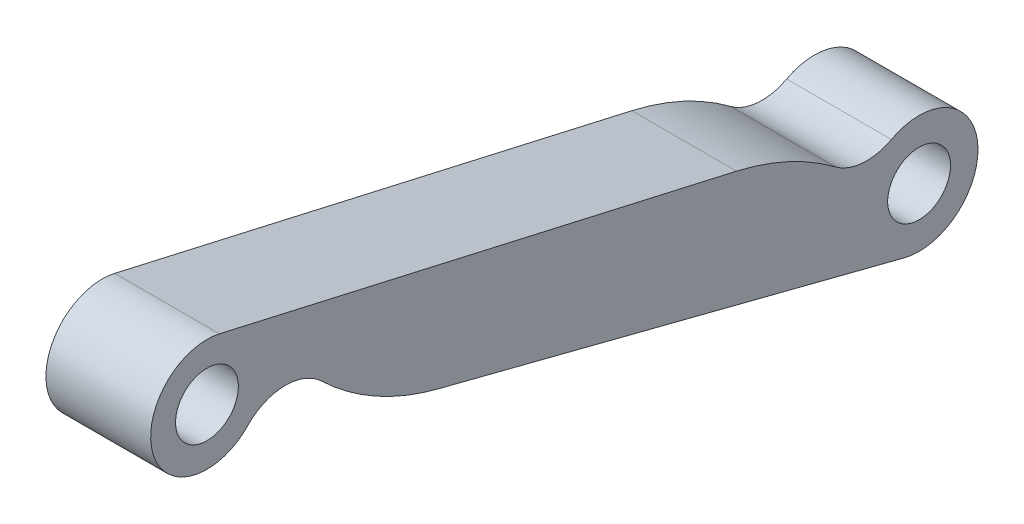
ISO-10303-21;
HEADER;
FILE_DESCRIPTION(('STEP AP214'),'2;1');
FILE_NAME('part.step','',(''),(''),'','','');
FILE_SCHEMA(('AUTOMOTIVE_DESIGN { 1 0 10303 214 1 1 1 1 }'));
ENDSEC;
DATA;
#1=APPLICATION_CONTEXT('core data for automotive mechanical design processes');
#2=APPLICATION_PROTOCOL_DEFINITION('international standard','automotive_design',2000,#1);
#3=PRODUCT_CONTEXT('',#1,'mechanical');
#4=PRODUCT('Part','Part','',(#3));
#5=PRODUCT_RELATED_PRODUCT_CATEGORY('part','',(#4));
#6=PRODUCT_DEFINITION_FORMATION('','',#4);
#7=PRODUCT_DEFINITION_CONTEXT('part definition',#1,'design');
#8=PRODUCT_DEFINITION('design','',#6,#7);
#9=PRODUCT_DEFINITION_SHAPE('','',#8);
#10=(LENGTH_UNIT() NAMED_UNIT(*) SI_UNIT(.MILLI.,.METRE.));
#11=(NAMED_UNIT(*) PLANE_ANGLE_UNIT() SI_UNIT($,.RADIAN.));
#12=(NAMED_UNIT(*) SI_UNIT($,.STERADIAN.) SOLID_ANGLE_UNIT());
#13=UNCERTAINTY_MEASURE_WITH_UNIT(LENGTH_MEASURE(1.E-05),#10,'distance_accuracy_value','');
#14=(GEOMETRIC_REPRESENTATION_CONTEXT(3) GLOBAL_UNCERTAINTY_ASSIGNED_CONTEXT((#13)) GLOBAL_UNIT_ASSIGNED_CONTEXT((#10,
#11,#12)) REPRESENTATION_CONTEXT('',''));
#15=CARTESIAN_POINT('',(0.,0.,0.));
#16=DIRECTION('',(0.,0.,1.));
#17=DIRECTION('',(1.,0.,0.));
#18=AXIS2_PLACEMENT_3D('',#15,#16,#17);
#19=CARTESIAN_POINT('',(-2.,2.82842712474619,-41.0803439228481));
#20=DIRECTION('',(1.,0.,0.));
#21=DIRECTION('',(0.,0.,-1.));
#22=AXIS2_PLACEMENT_3D('',#19,#20,#21);
#23=CYLINDRICAL_SURFACE('',#22,2.15);
#24=DIRECTION('',(1.,0.,0.));
#25=VECTOR('',#24,1.);
#26=CARTESIAN_POINT('',(-2.,1.34285991695244,-42.634560790318));
#27=LINE('',#26,#25);
#28=CARTESIAN_POINT('',(-2.,1.34285991695244,-42.634560790318));
#29=VERTEX_POINT('',#28);
#30=CARTESIAN_POINT('',(2.,1.34285991695244,-42.634560790318));
#31=VERTEX_POINT('',#30);
#32=EDGE_CURVE('E107',#29,#31,#27,.T.);
#33=ORIENTED_EDGE('',*,*,#32,.T.);
#34=CARTESIAN_POINT('',(2.,2.82842712474619,-41.0803439228481));
#35=DIRECTION('',(1.,0.,0.));
#36=DIRECTION('',(0.,0.,-1.));
#37=AXIS2_PLACEMENT_3D('',#34,#35,#36);
#38=CIRCLE('',#37,2.15);
#39=CARTESIAN_POINT('',(2.,4.92482547309636,-41.5574329764164));
#40=VERTEX_POINT('',#39);
#41=EDGE_CURVE('E113',#40,#31,#38,.T.);
#42=ORIENTED_EDGE('',*,*,#41,.F.);
#43=DIRECTION('',(1.,0.,0.));
#44=VECTOR('',#43,1.);
#45=CARTESIAN_POINT('',(-2.,4.92482547309636,-41.5574329764164));
#46=LINE('',#45,#44);
#47=CARTESIAN_POINT('',(-2.,4.92482547309636,-41.5574329764164));
#48=VERTEX_POINT('',#47);
#49=EDGE_CURVE('E161',#48,#40,#46,.T.);
#50=ORIENTED_EDGE('',*,*,#49,.F.);
#51=CARTESIAN_POINT('',(-2.,2.82842712474619,-41.0803439228481));
#52=DIRECTION('',(1.,0.,0.));
#53=DIRECTION('',(0.,0.,-1.));
#54=AXIS2_PLACEMENT_3D('',#51,#52,#53);
#55=CIRCLE('',#54,2.15);
#56=EDGE_CURVE('E119',#48,#29,#55,.T.);
#57=ORIENTED_EDGE('',*,*,#56,.T.);
#58=EDGE_LOOP('',(#33,#42,#50,#57));
#59=FACE_BOUND('',#58,.T.);
#60=ADVANCED_FACE('F39',(#59),#23,.T.);
#61=CARTESIAN_POINT('',(-2.,13.6740920658674,-3.1118893254445));
#62=DIRECTION('',(0.,-0.975068999232636,0.221901885380601));
#63=DIRECTION('',(0.,-0.221901885380601,-0.975068999232636));
#64=AXIS2_PLACEMENT_3D('',#61,#62,#63);
#65=PLANE('',#64);
#66=DIRECTION('',(0.,-0.221901885380601,-0.975068999232636));
#67=VECTOR('',#66,1.);
#68=CARTESIAN_POINT('',(2.,13.6740920658674,-3.1118893254445));
#69=LINE('',#68,#67);
#70=CARTESIAN_POINT('',(2.,0.43018265181614,-61.3075440227329));
#71=VERTEX_POINT('',#70);
#72=EDGE_CURVE('E127',#40,#71,#69,.T.);
#73=ORIENTED_EDGE('',*,*,#72,.T.);
#74=DIRECTION('',(1.,0.,0.));
#75=VECTOR('',#74,1.);
#76=CARTESIAN_POINT('',(-2.,0.430182651816144,-61.3075440227328));
#77=LINE('',#76,#75);
#78=CARTESIAN_POINT('',(-2.,0.43018265181614,-61.3075440227329));
#79=VERTEX_POINT('',#78);
#80=EDGE_CURVE('E175',#71,#79,#77,.F.);
#81=ORIENTED_EDGE('',*,*,#80,.T.);
#82=DIRECTION('',(0.,-0.221901885380601,-0.975068999232636));
#83=VECTOR('',#82,1.);
#84=CARTESIAN_POINT('',(-2.,13.6740920658674,-3.1118893254445));
#85=LINE('',#84,#83);
#86=EDGE_CURVE('E153',#48,#79,#85,.T.);
#87=ORIENTED_EDGE('',*,*,#86,.F.);
#88=ORIENTED_EDGE('',*,*,#49,.T.);
#89=EDGE_LOOP('',(#73,#81,#87,#88));
#90=FACE_BOUND('',#89,.T.);
#91=ADVANCED_FACE('F193',(#90),#65,.F.);
#92=CARTESIAN_POINT('',(-2.,0.285898384862234,-66.2799762769808));
#93=DIRECTION('',(1.,0.,0.));
#94=DIRECTION('',(0.,0.,-1.));
#95=AXIS2_PLACEMENT_3D('',#92,#93,#94);
#96=CYLINDRICAL_SURFACE('',#95,2.);
#97=CARTESIAN_POINT('',(-2.,0.285898384862234,-66.2799762769808));
#98=DIRECTION('',(1.,0.,0.));
#99=DIRECTION('',(0.,0.,-1.));
#100=AXIS2_PLACEMENT_3D('',#97,#98,#99);
#101=CIRCLE('',#100,2.);
#102=CARTESIAN_POINT('',(-2.,-1.31516923603317,-65.0814010923052));
#103=VERTEX_POINT('',#102);
#104=CARTESIAN_POINT('',(-2.,-1.4788074974907,-67.2211527475691));
#105=VERTEX_POINT('',#104);
#106=EDGE_CURVE('E151',#103,#105,#101,.T.);
#107=ORIENTED_EDGE('',*,*,#106,.F.);
#108=DIRECTION('',(1.,0.,0.));
#109=VECTOR('',#108,1.);
#110=CARTESIAN_POINT('',(-2.,-1.31516923603317,-65.0814010923052));
#111=LINE('',#110,#109);
#112=CARTESIAN_POINT('',(2.,-1.31516923603317,-65.0814010923052));
#113=VERTEX_POINT('',#112);
#114=EDGE_CURVE('E163',#103,#113,#111,.T.);
#115=ORIENTED_EDGE('',*,*,#114,.T.);
#116=CARTESIAN_POINT('',(2.,0.285898384862234,-66.2799762769808));
#117=DIRECTION('',(1.,0.,0.));
#118=DIRECTION('',(0.,0.,-1.));
#119=AXIS2_PLACEMENT_3D('',#116,#117,#118);
#120=CIRCLE('',#119,2.);
#121=CARTESIAN_POINT('',(2.,-1.4788074974907,-67.2211527475691));
#122=VERTEX_POINT('',#121);
#123=EDGE_CURVE('E134',#113,#122,#120,.T.);
#124=ORIENTED_EDGE('',*,*,#123,.T.);
#125=DIRECTION('',(1.,0.,0.));
#126=VECTOR('',#125,1.);
#127=CARTESIAN_POINT('',(-2.,-1.4788074974907,-67.2211527475691));
#128=LINE('',#127,#126);
#129=EDGE_CURVE('E164',#105,#122,#128,.T.);
#130=ORIENTED_EDGE('',*,*,#129,.F.);
#131=EDGE_LOOP('',(#107,#115,#124,#130));
#132=FACE_BOUND('',#131,.T.);
#133=ADVANCED_FACE('F190',(#132),#96,.F.);
#134=CARTESIAN_POINT('',(-2.,-3.46410161513775,-68.2799762769809));
#135=DIRECTION('',(1.,0.,0.));
#136=DIRECTION('',(0.,0.,-1.));
#137=AXIS2_PLACEMENT_3D('',#134,#135,#136);
#138=CYLINDRICAL_SURFACE('',#137,2.25);
#139=ORIENTED_EDGE('',*,*,#129,.T.);
#140=CARTESIAN_POINT('',(2.,-3.46410161513775,-68.2799762769809));
#141=DIRECTION('',(1.,0.,0.));
#142=DIRECTION('',(0.,0.,-1.));
#143=AXIS2_PLACEMENT_3D('',#140,#141,#142);
#144=CIRCLE('',#143,2.25);
#145=CARTESIAN_POINT('',(2.,-5.64351290041751,-67.7208104253811));
#146=VERTEX_POINT('',#145);
#147=EDGE_CURVE('E131',#146,#122,#144,.T.);
#148=ORIENTED_EDGE('',*,*,#147,.F.);
#149=DIRECTION('',(1.,0.,0.));
#150=VECTOR('',#149,1.);
#151=CARTESIAN_POINT('',(-2.,-5.64351290041751,-67.7208104253811));
#152=LINE('',#151,#150);
#153=CARTESIAN_POINT('',(-2.,-5.64351290041751,-67.7208104253811));
#154=VERTEX_POINT('',#153);
#155=EDGE_CURVE('E120',#154,#146,#152,.T.);
#156=ORIENTED_EDGE('',*,*,#155,.F.);
#157=CARTESIAN_POINT('',(-2.,-3.46410161513775,-68.2799762769809));
#158=DIRECTION('',(1.,0.,0.));
#159=DIRECTION('',(0.,0.,-1.));
#160=AXIS2_PLACEMENT_3D('',#157,#158,#159);
#161=CIRCLE('',#160,2.25);
#162=EDGE_CURVE('E148',#154,#105,#161,.T.);
#163=ORIENTED_EDGE('',*,*,#162,.T.);
#164=EDGE_LOOP('',(#139,#148,#156,#163));
#165=FACE_BOUND('',#164,.T.);
#166=ADVANCED_FACE('F199',(#165),#138,.T.);
#167=CARTESIAN_POINT('',(-2.,11.0068896839787,-2.82400888954569));
#168=DIRECTION('',(0.,-0.968627237902113,0.248518156266547));
#169=DIRECTION('',(0.,-0.248518156266547,-0.968627237902113));
#170=AXIS2_PLACEMENT_3D('',#167,#168,#169);
#171=PLANE('',#170);
#172=DIRECTION('',(0.,-0.248518156266547,-0.968627237902113));
#173=VECTOR('',#172,1.);
#174=CARTESIAN_POINT('',(2.,11.0068896839787,-2.82400888954569));
#175=LINE('',#174,#173);
#176=CARTESIAN_POINT('',(2.,-1.07415762473069,-49.9112384964196));
#177=VERTEX_POINT('',#176);
#178=EDGE_CURVE('E112',#177,#146,#175,.T.);
#179=ORIENTED_EDGE('',*,*,#178,.F.);
#180=DIRECTION('',(-1.,0.,0.));
#181=VECTOR('',#180,1.);
#182=CARTESIAN_POINT('',(-2.,-1.07415762473068,-49.9112384964196));
#183=LINE('',#182,#181);
#184=CARTESIAN_POINT('',(-2.,-1.07415762473069,-49.9112384964196));
#185=VERTEX_POINT('',#184);
#186=EDGE_CURVE('E11',#177,#185,#183,.T.);
#187=ORIENTED_EDGE('',*,*,#186,.T.);
#188=DIRECTION('',(0.,-0.248518156266547,-0.968627237902113));
#189=VECTOR('',#188,1.);
#190=CARTESIAN_POINT('',(-2.,11.0068896839787,-2.82400888954569));
#191=LINE('',#190,#189);
#192=EDGE_CURVE('E146',#185,#154,#191,.T.);
#193=ORIENTED_EDGE('',*,*,#192,.T.);
#194=ORIENTED_EDGE('',*,*,#155,.T.);
#195=EDGE_LOOP('',(#179,#187,#193,#194));
#196=FACE_BOUND('',#195,.T.);
#197=ADVANCED_FACE('F195',(#196),#171,.T.);
#198=CARTESIAN_POINT('',(-2.,-3.46410161513775,-68.2799762769809));
#199=DIRECTION('',(1.,0.,0.));
#200=DIRECTION('',(0.,0.,-1.));
#201=AXIS2_PLACEMENT_3D('',#198,#199,#200);
#202=CYLINDRICAL_SURFACE('',#201,1.2);
#203=CARTESIAN_POINT('',(-2.,-3.46410161513775,-68.2799762769809));
#204=DIRECTION('',(1.,0.,0.));
#205=DIRECTION('',(0.,0.,-1.));
#206=AXIS2_PLACEMENT_3D('',#203,#204,#205);
#207=CIRCLE('',#206,1.2);
#208=CARTESIAN_POINT('',(-2.,-3.46410161513775,-69.4799762769809));
#209=VERTEX_POINT('',#208);
#210=EDGE_CURVE('E156',#209,#209,#207,.T.);
#211=ORIENTED_EDGE('',*,*,#210,.F.);
#212=EDGE_LOOP('',(#211));
#213=FACE_BOUND('',#212,.T.);
#214=CARTESIAN_POINT('',(2.,-3.46410161513775,-68.2799762769809));
#215=DIRECTION('',(1.,0.,0.));
#216=DIRECTION('',(0.,0.,-1.));
#217=AXIS2_PLACEMENT_3D('',#214,#215,#216);
#218=CIRCLE('',#217,1.2);
#219=CARTESIAN_POINT('',(2.,-3.46410161513775,-69.4799762769809));
#220=VERTEX_POINT('',#219);
#221=EDGE_CURVE('E137',#220,#220,#218,.T.);
#222=ORIENTED_EDGE('',*,*,#221,.T.);
#223=EDGE_LOOP('',(#222));
#224=FACE_BOUND('',#223,.T.);
#225=ADVANCED_FACE('F206',(#213,#224),#202,.F.);
#226=CARTESIAN_POINT('',(-2.,-0.0390630670417417,-44.0803439228481));
#227=DIRECTION('',(1.,0.,0.));
#228=DIRECTION('',(0.,0.,-1.));
#229=AXIS2_PLACEMENT_3D('',#226,#227,#228);
#230=CYLINDRICAL_SURFACE('',#229,2.);
#231=CARTESIAN_POINT('',(-2.,-0.0390630670417417,-44.0803439228481));
#232=DIRECTION('',(1.,0.,0.));
#233=DIRECTION('',(0.,0.,-1.));
#234=AXIS2_PLACEMENT_3D('',#231,#232,#233);
#235=CIRCLE('',#234,2.);
#236=CARTESIAN_POINT('',(-2.,1.40279990318029,-45.4663566122209));
#237=VERTEX_POINT('',#236);
#238=EDGE_CURVE('E144',#237,#29,#235,.T.);
#239=ORIENTED_EDGE('',*,*,#238,.F.);
#240=DIRECTION('',(1.,0.,0.));
#241=VECTOR('',#240,1.);
#242=CARTESIAN_POINT('',(-2.,1.40279990318029,-45.4663566122209));
#243=LINE('',#242,#241);
#244=CARTESIAN_POINT('',(2.,1.40279990318029,-45.4663566122209));
#245=VERTEX_POINT('',#244);
#246=EDGE_CURVE('E47',#237,#245,#243,.T.);
#247=ORIENTED_EDGE('',*,*,#246,.T.);
#248=CARTESIAN_POINT('',(2.,-0.0390630670417417,-44.0803439228481));
#249=DIRECTION('',(1.,0.,0.));
#250=DIRECTION('',(0.,0.,-1.));
#251=AXIS2_PLACEMENT_3D('',#248,#249,#250);
#252=CIRCLE('',#251,2.);
#253=EDGE_CURVE('E104',#245,#31,#252,.T.);
#254=ORIENTED_EDGE('',*,*,#253,.T.);
#255=ORIENTED_EDGE('',*,*,#32,.F.);
#256=EDGE_LOOP('',(#239,#247,#254,#255));
#257=FACE_BOUND('',#256,.T.);
#258=ADVANCED_FACE('F106',(#257),#230,.F.);
#259=CARTESIAN_POINT('',(-2.,2.82842712474619,-41.0803439228481));
#260=DIRECTION('',(1.,0.,0.));
#261=DIRECTION('',(0.,0.,-1.));
#262=AXIS2_PLACEMENT_3D('',#259,#260,#261);
#263=CYLINDRICAL_SURFACE('',#262,1.2);
#264=CARTESIAN_POINT('',(-2.,2.82842712474619,-41.0803439228481));
#265=DIRECTION('',(1.,0.,0.));
#266=DIRECTION('',(0.,0.,-1.));
#267=AXIS2_PLACEMENT_3D('',#264,#265,#266);
#268=CIRCLE('',#267,1.2);
#269=CARTESIAN_POINT('',(-2.,2.82842712474619,-42.2803439228481));
#270=VERTEX_POINT('',#269);
#271=EDGE_CURVE('E121',#270,#270,#268,.T.);
#272=ORIENTED_EDGE('',*,*,#271,.F.);
#273=EDGE_LOOP('',(#272));
#274=FACE_BOUND('',#273,.T.);
#275=CARTESIAN_POINT('',(2.,2.82842712474619,-41.0803439228481));
#276=DIRECTION('',(1.,0.,0.));
#277=DIRECTION('',(0.,0.,-1.));
#278=AXIS2_PLACEMENT_3D('',#275,#276,#277);
#279=CIRCLE('',#278,1.2);
#280=CARTESIAN_POINT('',(2.,2.82842712474619,-42.2803439228481));
#281=VERTEX_POINT('',#280);
#282=EDGE_CURVE('E140',#281,#281,#279,.T.);
#283=ORIENTED_EDGE('',*,*,#282,.T.);
#284=EDGE_LOOP('',(#283));
#285=FACE_BOUND('',#284,.T.);
#286=ADVANCED_FACE('F225',(#274,#285),#263,.F.);
#287=CARTESIAN_POINT('',(-2.,0.,0.));
#288=DIRECTION('',(1.,0.,0.));
#289=DIRECTION('',(0.,0.,-1.));
#290=AXIS2_PLACEMENT_3D('',#287,#288,#289);
#291=PLANE('',#290);
#292=ORIENTED_EDGE('',*,*,#86,.T.);
#293=CARTESIAN_POINT('',(-2.,-9.32050734051022,-59.0885251689268));
#294=DIRECTION('',(1.,0.,0.));
#295=DIRECTION('',(0.,0.,-1.));
#296=AXIS2_PLACEMENT_3D('',#293,#294,#295);
#297=CIRCLE('',#296,10.);
#298=EDGE_CURVE('E178',#79,#103,#297,.F.);
#299=ORIENTED_EDGE('',*,*,#298,.T.);
#300=ORIENTED_EDGE('',*,*,#106,.T.);
#301=ORIENTED_EDGE('',*,*,#162,.F.);
#302=ORIENTED_EDGE('',*,*,#192,.F.);
#303=CARTESIAN_POINT('',(-2.,8.61211475429044,-52.3964200590851));
#304=DIRECTION('',(1.,0.,0.));
#305=DIRECTION('',(0.,0.,-1.));
#306=AXIS2_PLACEMENT_3D('',#303,#304,#305);
#307=CIRCLE('',#306,10.);
#308=EDGE_CURVE('E54',#185,#237,#307,.F.);
#309=ORIENTED_EDGE('',*,*,#308,.T.);
#310=ORIENTED_EDGE('',*,*,#238,.T.);
#311=ORIENTED_EDGE('',*,*,#56,.F.);
#312=EDGE_LOOP('',(#292,#299,#300,#301,#302,#309,#310,#311));
#313=FACE_BOUND('',#312,.T.);
#314=ORIENTED_EDGE('',*,*,#210,.T.);
#315=EDGE_LOOP('',(#314));
#316=FACE_BOUND('',#315,.T.);
#317=ORIENTED_EDGE('',*,*,#271,.T.);
#318=EDGE_LOOP('',(#317));
#319=FACE_BOUND('',#318,.T.);
#320=ADVANCED_FACE('F181',(#313,#316,#319),#291,.F.);
#321=CARTESIAN_POINT('',(2.,0.,0.));
#322=DIRECTION('',(1.,0.,0.));
#323=DIRECTION('',(0.,0.,-1.));
#324=AXIS2_PLACEMENT_3D('',#321,#322,#323);
#325=PLANE('',#324);
#326=ORIENTED_EDGE('',*,*,#123,.F.);
#327=CARTESIAN_POINT('',(2.,-9.32050734051022,-59.0885251689268));
#328=DIRECTION('',(1.,0.,0.));
#329=DIRECTION('',(0.,0.,-1.));
#330=AXIS2_PLACEMENT_3D('',#327,#328,#329);
#331=CIRCLE('',#330,10.);
#332=EDGE_CURVE('E173',#113,#71,#331,.T.);
#333=ORIENTED_EDGE('',*,*,#332,.T.);
#334=ORIENTED_EDGE('',*,*,#72,.F.);
#335=ORIENTED_EDGE('',*,*,#41,.T.);
#336=ORIENTED_EDGE('',*,*,#253,.F.);
#337=CARTESIAN_POINT('',(2.,8.61211475429044,-52.3964200590851));
#338=DIRECTION('',(1.,0.,0.));
#339=DIRECTION('',(0.,0.,-1.));
#340=AXIS2_PLACEMENT_3D('',#337,#338,#339);
#341=CIRCLE('',#340,10.);
#342=EDGE_CURVE('E171',#245,#177,#341,.T.);
#343=ORIENTED_EDGE('',*,*,#342,.T.);
#344=ORIENTED_EDGE('',*,*,#178,.T.);
#345=ORIENTED_EDGE('',*,*,#147,.T.);
#346=EDGE_LOOP('',(#326,#333,#334,#335,#336,#343,#344,#345));
#347=FACE_BOUND('',#346,.T.);
#348=ORIENTED_EDGE('',*,*,#221,.F.);
#349=EDGE_LOOP('',(#348));
#350=FACE_BOUND('',#349,.T.);
#351=ORIENTED_EDGE('',*,*,#282,.F.);
#352=EDGE_LOOP('',(#351));
#353=FACE_BOUND('',#352,.T.);
#354=ADVANCED_FACE('F124',(#347,#350,#353),#325,.T.);
#355=CARTESIAN_POINT('',(-2.,-9.32050734051022,-59.0885251689268));
#356=DIRECTION('',(1.,0.,0.));
#357=DIRECTION('',(0.,0.,-1.));
#358=AXIS2_PLACEMENT_3D('',#355,#356,#357);
#359=CYLINDRICAL_SURFACE('',#358,10.);
#360=ORIENTED_EDGE('',*,*,#298,.F.);
#361=ORIENTED_EDGE('',*,*,#80,.F.);
#362=ORIENTED_EDGE('',*,*,#332,.F.);
#363=ORIENTED_EDGE('',*,*,#114,.F.);
#364=EDGE_LOOP('',(#360,#361,#362,#363));
#365=FACE_BOUND('',#364,.T.);
#366=ADVANCED_FACE('F191',(#365),#359,.T.);
#367=CARTESIAN_POINT('',(-2.,8.61211475429044,-52.3964200590851));
#368=DIRECTION('',(1.,0.,0.));
#369=DIRECTION('',(0.,0.,-1.));
#370=AXIS2_PLACEMENT_3D('',#367,#368,#369);
#371=CYLINDRICAL_SURFACE('',#370,10.);
#372=ORIENTED_EDGE('',*,*,#308,.F.);
#373=ORIENTED_EDGE('',*,*,#186,.F.);
#374=ORIENTED_EDGE('',*,*,#342,.F.);
#375=ORIENTED_EDGE('',*,*,#246,.F.);
#376=EDGE_LOOP('',(#372,#373,#374,#375));
#377=FACE_BOUND('',#376,.T.);
#378=ADVANCED_FACE('F41',(#377),#371,.T.);
#379=CLOSED_SHELL('',(#60,#91,#133,#166,#197,#225,#258,#286,#320,#354,#366,#378));
#380=MANIFOLD_SOLID_BREP('B2',#379);
#381=ADVANCED_BREP_SHAPE_REPRESENTATION('',(#18,#380),#14);
#382=SHAPE_DEFINITION_REPRESENTATION(#9,#381);
ENDSEC;
END-ISO-10303-21;
